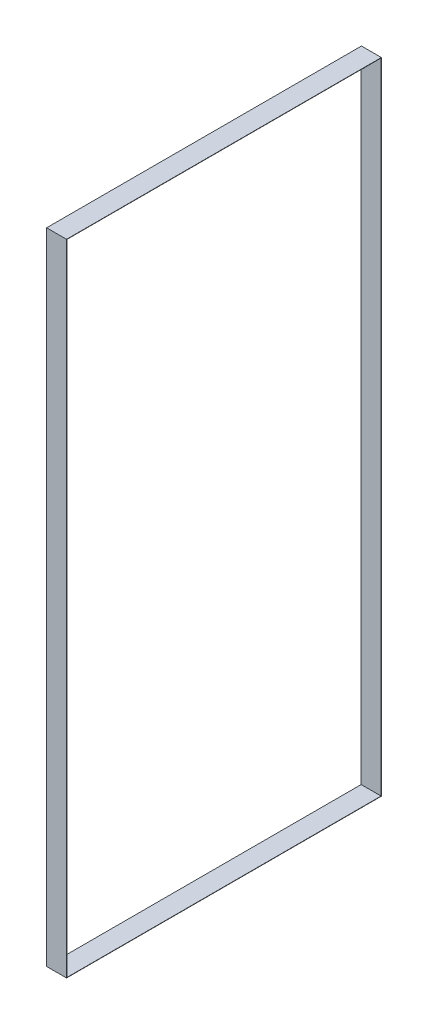
ISO-10303-21;
HEADER;
FILE_DESCRIPTION(('STEP AP214'),'2;1');
FILE_NAME('part.step','',(''),(''),'','','');
FILE_SCHEMA(('AUTOMOTIVE_DESIGN { 1 0 10303 214 1 1 1 1 }'));
ENDSEC;
DATA;
#1=APPLICATION_CONTEXT('core data for automotive mechanical design processes');
#2=APPLICATION_PROTOCOL_DEFINITION('international standard','automotive_design',2000,#1);
#3=PRODUCT_CONTEXT('',#1,'mechanical');
#4=PRODUCT('Part','Part','',(#3));
#5=PRODUCT_RELATED_PRODUCT_CATEGORY('part','',(#4));
#6=PRODUCT_DEFINITION_FORMATION('','',#4);
#7=PRODUCT_DEFINITION_CONTEXT('part definition',#1,'design');
#8=PRODUCT_DEFINITION('design','',#6,#7);
#9=PRODUCT_DEFINITION_SHAPE('','',#8);
#10=(LENGTH_UNIT() NAMED_UNIT(*) SI_UNIT(.MILLI.,.METRE.));
#11=(NAMED_UNIT(*) PLANE_ANGLE_UNIT() SI_UNIT($,.RADIAN.));
#12=(NAMED_UNIT(*) SI_UNIT($,.STERADIAN.) SOLID_ANGLE_UNIT());
#13=UNCERTAINTY_MEASURE_WITH_UNIT(LENGTH_MEASURE(1.E-05),#10,'distance_accuracy_value','');
#14=(GEOMETRIC_REPRESENTATION_CONTEXT(3) GLOBAL_UNCERTAINTY_ASSIGNED_CONTEXT((#13)) GLOBAL_UNIT_ASSIGNED_CONTEXT((#10,
#11,#12)) REPRESENTATION_CONTEXT('',''));
#15=CARTESIAN_POINT('',(0.,0.,0.));
#16=DIRECTION('',(0.,0.,1.));
#17=DIRECTION('',(1.,0.,0.));
#18=AXIS2_PLACEMENT_3D('',#15,#16,#17);
#19=CARTESIAN_POINT('',(-30.7630000000155,27.2313800000029,3.89916));
#20=DIRECTION('',(0.,0.,-1.));
#21=DIRECTION('',(-5.10347319959692E-12,-1.,0.));
#22=AXIS2_PLACEMENT_3D('',#19,#20,#21);
#23=PLANE('',#22);
#24=DIRECTION('',(-1.,5.10347319959692E-12,0.));
#25=VECTOR('',#24,1.);
#26=CARTESIAN_POINT('',(-30.7630000000155,27.2313800000029,3.89916));
#27=LINE('',#26,#25);
#28=CARTESIAN_POINT('',(-30.7630000000155,27.2313800000029,3.89916));
#29=VERTEX_POINT('',#28);
#30=CARTESIAN_POINT('',(-30.9530000000155,27.2313800000039,3.89916));
#31=VERTEX_POINT('',#30);
#32=EDGE_CURVE('E11',#29,#31,#27,.T.);
#33=ORIENTED_EDGE('',*,*,#32,.T.);
#34=DIRECTION('',(5.10347319959692E-12,1.,0.));
#35=VECTOR('',#34,1.);
#36=CARTESIAN_POINT('',(-30.9530000000155,27.2313800000039,3.89916));
#37=LINE('',#36,#35);
#38=CARTESIAN_POINT('',(-30.9529999999845,33.3273800000039,3.89916));
#39=VERTEX_POINT('',#38);
#40=EDGE_CURVE('E148',#31,#39,#37,.T.);
#41=ORIENTED_EDGE('',*,*,#40,.T.);
#42=DIRECTION('',(1.,-5.10347319959692E-12,0.));
#43=VECTOR('',#42,1.);
#44=CARTESIAN_POINT('',(-30.9529999999845,33.3273800000039,3.89916));
#45=LINE('',#44,#43);
#46=CARTESIAN_POINT('',(-30.7629999999845,33.3273800000029,3.89916));
#47=VERTEX_POINT('',#46);
#48=EDGE_CURVE('E137',#39,#47,#45,.T.);
#49=ORIENTED_EDGE('',*,*,#48,.T.);
#50=DIRECTION('',(-5.10347319959692E-12,-1.,0.));
#51=VECTOR('',#50,1.);
#52=CARTESIAN_POINT('',(-30.7629999999845,33.3273800000029,3.89916));
#53=LINE('',#52,#51);
#54=EDGE_CURVE('E162',#47,#29,#53,.T.);
#55=ORIENTED_EDGE('',*,*,#54,.T.);
#56=EDGE_LOOP('',(#33,#41,#49,#55));
#57=FACE_BOUND('',#56,.T.);
#58=ADVANCED_FACE('F16',(#57),#23,.T.);
#59=CARTESIAN_POINT('',(-30.9530000000155,27.2313800000039,0.90216));
#60=DIRECTION('',(0.,0.,1.));
#61=DIRECTION('',(1.,-5.10347319959692E-12,0.));
#62=AXIS2_PLACEMENT_3D('',#59,#60,#61);
#63=PLANE('',#62);
#64=DIRECTION('',(1.,-5.10347319959692E-12,0.));
#65=VECTOR('',#64,1.);
#66=CARTESIAN_POINT('',(-30.9530000000155,27.2313800000039,0.90216));
#67=LINE('',#66,#65);
#68=CARTESIAN_POINT('',(-30.9530000000155,27.2313800000039,0.90216));
#69=VERTEX_POINT('',#68);
#70=CARTESIAN_POINT('',(-30.7630000000155,27.2313800000029,0.90216));
#71=VERTEX_POINT('',#70);
#72=EDGE_CURVE('E27',#69,#71,#67,.T.);
#73=ORIENTED_EDGE('',*,*,#72,.T.);
#74=DIRECTION('',(5.10347319959692E-12,1.,0.));
#75=VECTOR('',#74,1.);
#76=CARTESIAN_POINT('',(-30.7630000000155,27.2313800000029,0.90216));
#77=LINE('',#76,#75);
#78=CARTESIAN_POINT('',(-30.7629999999845,33.3273800000029,0.90216));
#79=VERTEX_POINT('',#78);
#80=EDGE_CURVE('E173',#71,#79,#77,.T.);
#81=ORIENTED_EDGE('',*,*,#80,.T.);
#82=DIRECTION('',(-1.,5.10347319959692E-12,0.));
#83=VECTOR('',#82,1.);
#84=CARTESIAN_POINT('',(-30.7629999999845,33.3273800000029,0.90216));
#85=LINE('',#84,#83);
#86=CARTESIAN_POINT('',(-30.9529999999845,33.3273800000039,0.90216));
#87=VERTEX_POINT('',#86);
#88=EDGE_CURVE('E163',#79,#87,#85,.T.);
#89=ORIENTED_EDGE('',*,*,#88,.T.);
#90=DIRECTION('',(-5.10347319959692E-12,-1.,0.));
#91=VECTOR('',#90,1.);
#92=CARTESIAN_POINT('',(-30.9529999999845,33.3273800000039,0.90216));
#93=LINE('',#92,#91);
#94=EDGE_CURVE('E166',#87,#69,#93,.T.);
#95=ORIENTED_EDGE('',*,*,#94,.T.);
#96=EDGE_LOOP('',(#73,#81,#89,#95));
#97=FACE_BOUND('',#96,.T.);
#98=ADVANCED_FACE('F196',(#97),#63,.T.);
#99=CARTESIAN_POINT('',(-30.7630000000155,27.2313800000029,0.90216));
#100=DIRECTION('',(5.10347319959692E-12,1.,0.));
#101=DIRECTION('',(1.,-5.10347319959692E-12,0.));
#102=AXIS2_PLACEMENT_3D('',#99,#100,#101);
#103=PLANE('',#102);
#104=ORIENTED_EDGE('',*,*,#72,.F.);
#105=DIRECTION('',(0.,0.,1.));
#106=VECTOR('',#105,1.);
#107=CARTESIAN_POINT('',(-30.9530000000155,27.2313800000039,0.90216));
#108=LINE('',#107,#106);
#109=EDGE_CURVE('E20',#69,#31,#108,.T.);
#110=ORIENTED_EDGE('',*,*,#109,.T.);
#111=ORIENTED_EDGE('',*,*,#32,.F.);
#112=DIRECTION('',(0.,0.,-1.));
#113=VECTOR('',#112,1.);
#114=CARTESIAN_POINT('',(-30.7630000000155,27.2313800000029,3.89916));
#115=LINE('',#114,#113);
#116=EDGE_CURVE('E172',#29,#71,#115,.T.);
#117=ORIENTED_EDGE('',*,*,#116,.T.);
#118=EDGE_LOOP('',(#104,#110,#111,#117));
#119=FACE_BOUND('',#118,.T.);
#120=ADVANCED_FACE('F191',(#119),#103,.T.);
#121=CARTESIAN_POINT('',(-30.9529999999845,33.3273800000039,0.90216));
#122=DIRECTION('',(-5.10347319959692E-12,-1.,0.));
#123=DIRECTION('',(0.,0.,-1.));
#124=AXIS2_PLACEMENT_3D('',#121,#122,#123);
#125=PLANE('',#124);
#126=ORIENTED_EDGE('',*,*,#88,.F.);
#127=DIRECTION('',(0.,0.,1.));
#128=VECTOR('',#127,1.);
#129=CARTESIAN_POINT('',(-30.7629999999845,33.3273800000029,0.90216));
#130=LINE('',#129,#128);
#131=EDGE_CURVE('E149',#79,#47,#130,.T.);
#132=ORIENTED_EDGE('',*,*,#131,.T.);
#133=ORIENTED_EDGE('',*,*,#48,.F.);
#134=DIRECTION('',(0.,0.,-1.));
#135=VECTOR('',#134,1.);
#136=CARTESIAN_POINT('',(-30.9529999999845,33.3273800000039,3.89916));
#137=LINE('',#136,#135);
#138=EDGE_CURVE('E144',#39,#87,#137,.T.);
#139=ORIENTED_EDGE('',*,*,#138,.T.);
#140=EDGE_LOOP('',(#126,#132,#133,#139));
#141=FACE_BOUND('',#140,.T.);
#142=ADVANCED_FACE('F202',(#141),#125,.T.);
#143=CARTESIAN_POINT('',(-30.9529999999845,33.3303800000039,0.89916));
#144=DIRECTION('',(-1.,5.10347319959692E-12,0.));
#145=DIRECTION('',(0.,0.,1.));
#146=AXIS2_PLACEMENT_3D('',#143,#144,#145);
#147=PLANE('',#146);
#148=ORIENTED_EDGE('',*,*,#138,.F.);
#149=ORIENTED_EDGE('',*,*,#40,.F.);
#150=ORIENTED_EDGE('',*,*,#109,.F.);
#151=ORIENTED_EDGE('',*,*,#94,.F.);
#152=EDGE_LOOP('',(#148,#149,#150,#151));
#153=FACE_BOUND('',#152,.T.);
#154=DIRECTION('',(5.10347319959692E-12,1.,0.));
#155=VECTOR('',#154,1.);
#156=CARTESIAN_POINT('',(-30.9530000000155,27.2283800000039,3.90216));
#157=LINE('',#156,#155);
#158=CARTESIAN_POINT('',(-30.9530000000155,27.2283800000039,3.90216));
#159=VERTEX_POINT('',#158);
#160=CARTESIAN_POINT('',(-30.9529999999845,33.3303800000039,3.90216));
#161=VERTEX_POINT('',#160);
#162=EDGE_CURVE('E58',#159,#161,#157,.T.);
#163=ORIENTED_EDGE('',*,*,#162,.T.);
#164=DIRECTION('',(0.,0.,-1.));
#165=VECTOR('',#164,1.);
#166=CARTESIAN_POINT('',(-30.9529999999845,33.3303800000039,3.90216));
#167=LINE('',#166,#165);
#168=CARTESIAN_POINT('',(-30.9529999999845,33.3303800000039,0.89916));
#169=VERTEX_POINT('',#168);
#170=EDGE_CURVE('E140',#161,#169,#167,.T.);
#171=ORIENTED_EDGE('',*,*,#170,.T.);
#172=DIRECTION('',(-5.10347319959692E-12,-1.,0.));
#173=VECTOR('',#172,1.);
#174=CARTESIAN_POINT('',(-30.9529999999845,33.3303800000039,0.89916));
#175=LINE('',#174,#173);
#176=CARTESIAN_POINT('',(-30.9530000000155,27.2283800000039,0.89916));
#177=VERTEX_POINT('',#176);
#178=EDGE_CURVE('E129',#169,#177,#175,.T.);
#179=ORIENTED_EDGE('',*,*,#178,.T.);
#180=DIRECTION('',(0.,0.,1.));
#181=VECTOR('',#180,1.);
#182=CARTESIAN_POINT('',(-30.9530000000155,27.2283800000039,0.89916));
#183=LINE('',#182,#181);
#184=EDGE_CURVE('E138',#177,#159,#183,.T.);
#185=ORIENTED_EDGE('',*,*,#184,.T.);
#186=EDGE_LOOP('',(#163,#171,#179,#185));
#187=FACE_BOUND('',#186,.T.);
#188=ADVANCED_FACE('F206',(#153,#187),#147,.T.);
#189=CARTESIAN_POINT('',(-30.7630000000155,27.2283800000029,0.89916));
#190=DIRECTION('',(1.,-5.10347319959692E-12,0.));
#191=DIRECTION('',(5.10347319959692E-12,1.,0.));
#192=AXIS2_PLACEMENT_3D('',#189,#190,#191);
#193=PLANE('',#192);
#194=ORIENTED_EDGE('',*,*,#80,.F.);
#195=ORIENTED_EDGE('',*,*,#116,.F.);
#196=ORIENTED_EDGE('',*,*,#54,.F.);
#197=ORIENTED_EDGE('',*,*,#131,.F.);
#198=EDGE_LOOP('',(#194,#195,#196,#197));
#199=FACE_BOUND('',#198,.T.);
#200=DIRECTION('',(0.,0.,-1.));
#201=VECTOR('',#200,1.);
#202=CARTESIAN_POINT('',(-30.7630000000155,27.2283800000029,3.90216));
#203=LINE('',#202,#201);
#204=CARTESIAN_POINT('',(-30.7630000000155,27.2283800000029,3.90216));
#205=VERTEX_POINT('',#204);
#206=CARTESIAN_POINT('',(-30.7630000000155,27.2283800000029,0.89916));
#207=VERTEX_POINT('',#206);
#208=EDGE_CURVE('E120',#205,#207,#203,.T.);
#209=ORIENTED_EDGE('',*,*,#208,.T.);
#210=DIRECTION('',(5.10347319959692E-12,1.,0.));
#211=VECTOR('',#210,1.);
#212=CARTESIAN_POINT('',(-30.7630000000155,27.2283800000029,0.89916));
#213=LINE('',#212,#211);
#214=CARTESIAN_POINT('',(-30.7629999999845,33.3303800000029,0.89916));
#215=VERTEX_POINT('',#214);
#216=EDGE_CURVE('E117',#207,#215,#213,.T.);
#217=ORIENTED_EDGE('',*,*,#216,.T.);
#218=DIRECTION('',(0.,0.,1.));
#219=VECTOR('',#218,1.);
#220=CARTESIAN_POINT('',(-30.7629999999845,33.3303800000029,0.89916));
#221=LINE('',#220,#219);
#222=CARTESIAN_POINT('',(-30.7629999999845,33.3303800000029,3.90216));
#223=VERTEX_POINT('',#222);
#224=EDGE_CURVE('E107',#215,#223,#221,.T.);
#225=ORIENTED_EDGE('',*,*,#224,.T.);
#226=DIRECTION('',(-5.10347319959692E-12,-1.,0.));
#227=VECTOR('',#226,1.);
#228=CARTESIAN_POINT('',(-30.7629999999845,33.3303800000029,3.90216));
#229=LINE('',#228,#227);
#230=EDGE_CURVE('E74',#223,#205,#229,.T.);
#231=ORIENTED_EDGE('',*,*,#230,.T.);
#232=EDGE_LOOP('',(#209,#217,#225,#231));
#233=FACE_BOUND('',#232,.T.);
#234=ADVANCED_FACE('F118',(#199,#233),#193,.T.);
#235=CARTESIAN_POINT('',(-30.9530000000155,27.2283800000039,3.90216));
#236=DIRECTION('',(0.,0.,1.));
#237=DIRECTION('',(1.,-5.10347319959692E-12,0.));
#238=AXIS2_PLACEMENT_3D('',#235,#236,#237);
#239=PLANE('',#238);
#240=DIRECTION('',(1.,-5.10347319959692E-12,0.));
#241=VECTOR('',#240,1.);
#242=CARTESIAN_POINT('',(-30.9530000000155,27.2283800000039,3.90216));
#243=LINE('',#242,#241);
#244=EDGE_CURVE('E141',#159,#205,#243,.T.);
#245=ORIENTED_EDGE('',*,*,#244,.T.);
#246=ORIENTED_EDGE('',*,*,#230,.F.);
#247=DIRECTION('',(-1.,5.10347319959692E-12,0.));
#248=VECTOR('',#247,1.);
#249=CARTESIAN_POINT('',(-30.7629999999845,33.3303800000029,3.90216));
#250=LINE('',#249,#248);
#251=EDGE_CURVE('E113',#223,#161,#250,.T.);
#252=ORIENTED_EDGE('',*,*,#251,.T.);
#253=ORIENTED_EDGE('',*,*,#162,.F.);
#254=EDGE_LOOP('',(#245,#246,#252,#253));
#255=FACE_BOUND('',#254,.T.);
#256=ADVANCED_FACE('F218',(#255),#239,.T.);
#257=CARTESIAN_POINT('',(-30.7629999999845,33.3303800000029,0.89916));
#258=DIRECTION('',(5.10347319959692E-12,1.,0.));
#259=DIRECTION('',(1.,-5.10347319959692E-12,0.));
#260=AXIS2_PLACEMENT_3D('',#257,#258,#259);
#261=PLANE('',#260);
#262=DIRECTION('',(-1.,5.10347319959692E-12,0.));
#263=VECTOR('',#262,1.);
#264=CARTESIAN_POINT('',(-30.7629999999845,33.3303800000029,0.89916));
#265=LINE('',#264,#263);
#266=EDGE_CURVE('E112',#215,#169,#265,.T.);
#267=ORIENTED_EDGE('',*,*,#266,.T.);
#268=ORIENTED_EDGE('',*,*,#170,.F.);
#269=ORIENTED_EDGE('',*,*,#251,.F.);
#270=ORIENTED_EDGE('',*,*,#224,.F.);
#271=EDGE_LOOP('',(#267,#268,#269,#270));
#272=FACE_BOUND('',#271,.T.);
#273=ADVANCED_FACE('F109',(#272),#261,.T.);
#274=CARTESIAN_POINT('',(-30.9530000000155,27.2283800000039,0.89916));
#275=DIRECTION('',(-5.10347319959692E-12,-1.,0.));
#276=DIRECTION('',(0.,0.,-1.));
#277=AXIS2_PLACEMENT_3D('',#274,#275,#276);
#278=PLANE('',#277);
#279=DIRECTION('',(1.,-5.10347319959692E-12,0.));
#280=VECTOR('',#279,1.);
#281=CARTESIAN_POINT('',(-30.9530000000155,27.2283800000039,0.89916));
#282=LINE('',#281,#280);
#283=EDGE_CURVE('E125',#177,#207,#282,.T.);
#284=ORIENTED_EDGE('',*,*,#283,.T.);
#285=ORIENTED_EDGE('',*,*,#208,.F.);
#286=ORIENTED_EDGE('',*,*,#244,.F.);
#287=ORIENTED_EDGE('',*,*,#184,.F.);
#288=EDGE_LOOP('',(#284,#285,#286,#287));
#289=FACE_BOUND('',#288,.T.);
#290=ADVANCED_FACE('F217',(#289),#278,.T.);
#291=CARTESIAN_POINT('',(-30.9529999999845,33.3303800000039,0.89916));
#292=DIRECTION('',(0.,0.,-1.));
#293=DIRECTION('',(-5.10347319959692E-12,-1.,0.));
#294=AXIS2_PLACEMENT_3D('',#291,#292,#293);
#295=PLANE('',#294);
#296=ORIENTED_EDGE('',*,*,#266,.F.);
#297=ORIENTED_EDGE('',*,*,#216,.F.);
#298=ORIENTED_EDGE('',*,*,#283,.F.);
#299=ORIENTED_EDGE('',*,*,#178,.F.);
#300=EDGE_LOOP('',(#296,#297,#298,#299));
#301=FACE_BOUND('',#300,.T.);
#302=ADVANCED_FACE('F18',(#301),#295,.T.);
#303=CLOSED_SHELL('',(#58,#98,#120,#142,#188,#234,#256,#273,#290,#302));
#304=MANIFOLD_SOLID_BREP('B1',#303);
#305=ADVANCED_BREP_SHAPE_REPRESENTATION('',(#18,#304),#14);
#306=SHAPE_DEFINITION_REPRESENTATION(#9,#305);
ENDSEC;
END-ISO-10303-21;
